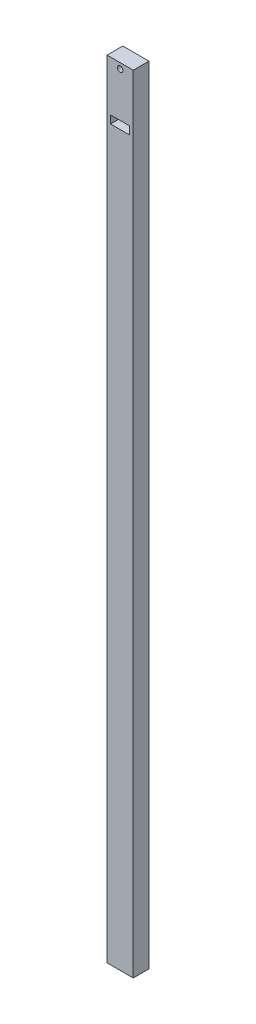
ISO-10303-21;
HEADER;
FILE_DESCRIPTION(('STEP AP214'),'2;1');
FILE_NAME('part.step','',(''),(''),'','','');
FILE_SCHEMA(('AUTOMOTIVE_DESIGN { 1 0 10303 214 1 1 1 1 }'));
ENDSEC;
DATA;
#1=APPLICATION_CONTEXT('core data for automotive mechanical design processes');
#2=APPLICATION_PROTOCOL_DEFINITION('international standard','automotive_design',2000,#1);
#3=PRODUCT_CONTEXT('',#1,'mechanical');
#4=PRODUCT('Part','Part','',(#3));
#5=PRODUCT_RELATED_PRODUCT_CATEGORY('part','',(#4));
#6=PRODUCT_DEFINITION_FORMATION('','',#4);
#7=PRODUCT_DEFINITION_CONTEXT('part definition',#1,'design');
#8=PRODUCT_DEFINITION('design','',#6,#7);
#9=PRODUCT_DEFINITION_SHAPE('','',#8);
#10=(LENGTH_UNIT() NAMED_UNIT(*) SI_UNIT(.MILLI.,.METRE.));
#11=(NAMED_UNIT(*) PLANE_ANGLE_UNIT() SI_UNIT($,.RADIAN.));
#12=(NAMED_UNIT(*) SI_UNIT($,.STERADIAN.) SOLID_ANGLE_UNIT());
#13=UNCERTAINTY_MEASURE_WITH_UNIT(LENGTH_MEASURE(1.E-05),#10,'distance_accuracy_value','');
#14=(GEOMETRIC_REPRESENTATION_CONTEXT(3) GLOBAL_UNCERTAINTY_ASSIGNED_CONTEXT((#13)) GLOBAL_UNIT_ASSIGNED_CONTEXT((#10,
#11,#12)) REPRESENTATION_CONTEXT('',''));
#15=CARTESIAN_POINT('',(0.,0.,0.));
#16=DIRECTION('',(0.,0.,1.));
#17=DIRECTION('',(1.,0.,0.));
#18=AXIS2_PLACEMENT_3D('',#15,#16,#17);
#19=CARTESIAN_POINT('',(0.,300.,6.));
#20=DIRECTION('',(0.,1.,0.));
#21=DIRECTION('',(0.,0.,1.));
#22=AXIS2_PLACEMENT_3D('',#19,#20,#21);
#23=PLANE('',#22);
#24=DIRECTION('',(1.,0.,0.));
#25=VECTOR('',#24,1.);
#26=CARTESIAN_POINT('',(0.,300.,0.));
#27=LINE('',#26,#25);
#28=CARTESIAN_POINT('',(0.,300.,0.));
#29=VERTEX_POINT('',#28);
#30=CARTESIAN_POINT('',(10.,300.,0.));
#31=VERTEX_POINT('',#30);
#32=EDGE_CURVE('E150',#29,#31,#27,.T.);
#33=ORIENTED_EDGE('',*,*,#32,.F.);
#34=DIRECTION('',(0.,0.,-1.));
#35=VECTOR('',#34,1.);
#36=CARTESIAN_POINT('',(0.,300.,6.));
#37=LINE('',#36,#35);
#38=CARTESIAN_POINT('',(0.,300.,6.));
#39=VERTEX_POINT('',#38);
#40=EDGE_CURVE('E11',#39,#29,#37,.T.);
#41=ORIENTED_EDGE('',*,*,#40,.F.);
#42=DIRECTION('',(1.,0.,0.));
#43=VECTOR('',#42,1.);
#44=CARTESIAN_POINT('',(0.,300.,6.));
#45=LINE('',#44,#43);
#46=CARTESIAN_POINT('',(10.,300.,6.));
#47=VERTEX_POINT('',#46);
#48=EDGE_CURVE('E128',#39,#47,#45,.T.);
#49=ORIENTED_EDGE('',*,*,#48,.T.);
#50=DIRECTION('',(0.,0.,-1.));
#51=VECTOR('',#50,1.);
#52=CARTESIAN_POINT('',(10.,300.,6.));
#53=LINE('',#52,#51);
#54=EDGE_CURVE('E89',#47,#31,#53,.T.);
#55=ORIENTED_EDGE('',*,*,#54,.T.);
#56=EDGE_LOOP('',(#33,#41,#49,#55));
#57=FACE_BOUND('',#56,.T.);
#58=ADVANCED_FACE('F35',(#57),#23,.T.);
#59=CARTESIAN_POINT('',(0.,0.,6.));
#60=DIRECTION('',(-1.,0.,0.));
#61=DIRECTION('',(0.,0.,1.));
#62=AXIS2_PLACEMENT_3D('',#59,#60,#61);
#63=PLANE('',#62);
#64=DIRECTION('',(0.,1.,0.));
#65=VECTOR('',#64,1.);
#66=CARTESIAN_POINT('',(0.,0.,0.));
#67=LINE('',#66,#65);
#68=CARTESIAN_POINT('',(0.,0.,0.));
#69=VERTEX_POINT('',#68);
#70=EDGE_CURVE('E117',#69,#29,#67,.T.);
#71=ORIENTED_EDGE('',*,*,#70,.F.);
#72=DIRECTION('',(0.,0.,-1.));
#73=VECTOR('',#72,1.);
#74=CARTESIAN_POINT('',(0.,0.,6.));
#75=LINE('',#74,#73);
#76=CARTESIAN_POINT('',(0.,0.,6.));
#77=VERTEX_POINT('',#76);
#78=EDGE_CURVE('E45',#77,#69,#75,.T.);
#79=ORIENTED_EDGE('',*,*,#78,.F.);
#80=DIRECTION('',(0.,1.,0.));
#81=VECTOR('',#80,1.);
#82=CARTESIAN_POINT('',(0.,0.,6.));
#83=LINE('',#82,#81);
#84=EDGE_CURVE('E115',#77,#39,#83,.T.);
#85=ORIENTED_EDGE('',*,*,#84,.T.);
#86=ORIENTED_EDGE('',*,*,#40,.T.);
#87=EDGE_LOOP('',(#71,#79,#85,#86));
#88=FACE_BOUND('',#87,.T.);
#89=ADVANCED_FACE('F113',(#88),#63,.T.);
#90=CARTESIAN_POINT('',(0.,0.,6.));
#91=DIRECTION('',(0.,1.,0.));
#92=DIRECTION('',(0.,0.,1.));
#93=AXIS2_PLACEMENT_3D('',#90,#91,#92);
#94=PLANE('',#93);
#95=DIRECTION('',(1.,0.,0.));
#96=VECTOR('',#95,1.);
#97=CARTESIAN_POINT('',(0.,0.,0.));
#98=LINE('',#97,#96);
#99=CARTESIAN_POINT('',(10.,0.,0.));
#100=VERTEX_POINT('',#99);
#101=EDGE_CURVE('E153',#69,#100,#98,.T.);
#102=ORIENTED_EDGE('',*,*,#101,.T.);
#103=DIRECTION('',(0.,0.,-1.));
#104=VECTOR('',#103,1.);
#105=CARTESIAN_POINT('',(10.,0.,6.));
#106=LINE('',#105,#104);
#107=CARTESIAN_POINT('',(10.,0.,6.));
#108=VERTEX_POINT('',#107);
#109=EDGE_CURVE('E120',#108,#100,#106,.T.);
#110=ORIENTED_EDGE('',*,*,#109,.F.);
#111=DIRECTION('',(1.,0.,0.));
#112=VECTOR('',#111,1.);
#113=CARTESIAN_POINT('',(0.,0.,6.));
#114=LINE('',#113,#112);
#115=EDGE_CURVE('E123',#77,#108,#114,.T.);
#116=ORIENTED_EDGE('',*,*,#115,.F.);
#117=ORIENTED_EDGE('',*,*,#78,.T.);
#118=EDGE_LOOP('',(#102,#110,#116,#117));
#119=FACE_BOUND('',#118,.T.);
#120=ADVANCED_FACE('F124',(#119),#94,.F.);
#121=CARTESIAN_POINT('',(0.,277.9,6.));
#122=DIRECTION('',(0.,1.,0.));
#123=DIRECTION('',(0.,0.,1.));
#124=AXIS2_PLACEMENT_3D('',#121,#122,#123);
#125=PLANE('',#124);
#126=DIRECTION('',(1.,0.,0.));
#127=VECTOR('',#126,1.);
#128=CARTESIAN_POINT('',(0.,277.9,0.));
#129=LINE('',#128,#127);
#130=CARTESIAN_POINT('',(1.34,277.9,0.));
#131=VERTEX_POINT('',#130);
#132=CARTESIAN_POINT('',(8.66000000000001,277.9,0.));
#133=VERTEX_POINT('',#132);
#134=EDGE_CURVE('E139',#131,#133,#129,.T.);
#135=ORIENTED_EDGE('',*,*,#134,.F.);
#136=DIRECTION('',(0.,0.,-1.));
#137=VECTOR('',#136,1.);
#138=CARTESIAN_POINT('',(1.34,277.9,6.));
#139=LINE('',#138,#137);
#140=CARTESIAN_POINT('',(1.34,277.9,6.));
#141=VERTEX_POINT('',#140);
#142=EDGE_CURVE('E39',#141,#131,#139,.T.);
#143=ORIENTED_EDGE('',*,*,#142,.F.);
#144=DIRECTION('',(1.,0.,0.));
#145=VECTOR('',#144,1.);
#146=CARTESIAN_POINT('',(0.,277.9,6.));
#147=LINE('',#146,#145);
#148=CARTESIAN_POINT('',(8.66000000000001,277.9,6.));
#149=VERTEX_POINT('',#148);
#150=EDGE_CURVE('E159',#141,#149,#147,.T.);
#151=ORIENTED_EDGE('',*,*,#150,.T.);
#152=DIRECTION('',(0.,0.,-1.));
#153=VECTOR('',#152,1.);
#154=CARTESIAN_POINT('',(8.66000000000001,277.9,6.));
#155=LINE('',#154,#153);
#156=EDGE_CURVE('E138',#149,#133,#155,.T.);
#157=ORIENTED_EDGE('',*,*,#156,.T.);
#158=EDGE_LOOP('',(#135,#143,#151,#157));
#159=FACE_BOUND('',#158,.T.);
#160=ADVANCED_FACE('F37',(#159),#125,.T.);
#161=CARTESIAN_POINT('',(1.33999999999986,0.,6.));
#162=DIRECTION('',(1.,0.,0.));
#163=DIRECTION('',(0.,1.,0.));
#164=AXIS2_PLACEMENT_3D('',#161,#162,#163);
#165=PLANE('',#164);
#166=DIRECTION('',(0.,-1.,0.));
#167=VECTOR('',#166,1.);
#168=CARTESIAN_POINT('',(1.33999999999986,0.,0.));
#169=LINE('',#168,#167);
#170=CARTESIAN_POINT('',(1.34,280.9,0.));
#171=VERTEX_POINT('',#170);
#172=EDGE_CURVE('E142',#171,#131,#169,.T.);
#173=ORIENTED_EDGE('',*,*,#172,.F.);
#174=DIRECTION('',(0.,0.,-1.));
#175=VECTOR('',#174,1.);
#176=CARTESIAN_POINT('',(1.34,280.9,6.));
#177=LINE('',#176,#175);
#178=CARTESIAN_POINT('',(1.34,280.9,6.));
#179=VERTEX_POINT('',#178);
#180=EDGE_CURVE('E165',#179,#171,#177,.T.);
#181=ORIENTED_EDGE('',*,*,#180,.F.);
#182=DIRECTION('',(0.,-1.,0.));
#183=VECTOR('',#182,1.);
#184=CARTESIAN_POINT('',(1.33999999999986,0.,6.));
#185=LINE('',#184,#183);
#186=EDGE_CURVE('E174',#179,#141,#185,.T.);
#187=ORIENTED_EDGE('',*,*,#186,.T.);
#188=ORIENTED_EDGE('',*,*,#142,.T.);
#189=EDGE_LOOP('',(#173,#181,#187,#188));
#190=FACE_BOUND('',#189,.T.);
#191=ADVANCED_FACE('F172',(#190),#165,.T.);
#192=CARTESIAN_POINT('',(0.,280.9,6.));
#193=DIRECTION('',(0.,1.,0.));
#194=DIRECTION('',(0.,0.,1.));
#195=AXIS2_PLACEMENT_3D('',#192,#193,#194);
#196=PLANE('',#195);
#197=DIRECTION('',(1.,0.,0.));
#198=VECTOR('',#197,1.);
#199=CARTESIAN_POINT('',(0.,280.9,0.));
#200=LINE('',#199,#198);
#201=CARTESIAN_POINT('',(8.66000000000001,280.9,0.));
#202=VERTEX_POINT('',#201);
#203=EDGE_CURVE('E145',#171,#202,#200,.T.);
#204=ORIENTED_EDGE('',*,*,#203,.T.);
#205=DIRECTION('',(0.,0.,-1.));
#206=VECTOR('',#205,1.);
#207=CARTESIAN_POINT('',(8.66000000000001,280.9,6.));
#208=LINE('',#207,#206);
#209=CARTESIAN_POINT('',(8.66000000000001,280.9,6.));
#210=VERTEX_POINT('',#209);
#211=EDGE_CURVE('E163',#210,#202,#208,.T.);
#212=ORIENTED_EDGE('',*,*,#211,.F.);
#213=DIRECTION('',(1.,0.,0.));
#214=VECTOR('',#213,1.);
#215=CARTESIAN_POINT('',(0.,280.9,6.));
#216=LINE('',#215,#214);
#217=EDGE_CURVE('E185',#179,#210,#216,.T.);
#218=ORIENTED_EDGE('',*,*,#217,.F.);
#219=ORIENTED_EDGE('',*,*,#180,.T.);
#220=EDGE_LOOP('',(#204,#212,#218,#219));
#221=FACE_BOUND('',#220,.T.);
#222=ADVANCED_FACE('F180',(#221),#196,.F.);
#223=CARTESIAN_POINT('',(10.,0.,6.));
#224=DIRECTION('',(-1.,0.,0.));
#225=DIRECTION('',(0.,0.,1.));
#226=AXIS2_PLACEMENT_3D('',#223,#224,#225);
#227=PLANE('',#226);
#228=DIRECTION('',(0.,1.,0.));
#229=VECTOR('',#228,1.);
#230=CARTESIAN_POINT('',(10.,0.,0.));
#231=LINE('',#230,#229);
#232=EDGE_CURVE('E82',#100,#31,#231,.T.);
#233=ORIENTED_EDGE('',*,*,#232,.T.);
#234=ORIENTED_EDGE('',*,*,#54,.F.);
#235=DIRECTION('',(0.,1.,0.));
#236=VECTOR('',#235,1.);
#237=CARTESIAN_POINT('',(10.,0.,6.));
#238=LINE('',#237,#236);
#239=EDGE_CURVE('E54',#108,#47,#238,.T.);
#240=ORIENTED_EDGE('',*,*,#239,.F.);
#241=ORIENTED_EDGE('',*,*,#109,.T.);
#242=EDGE_LOOP('',(#233,#234,#240,#241));
#243=FACE_BOUND('',#242,.T.);
#244=ADVANCED_FACE('F209',(#243),#227,.F.);
#245=CARTESIAN_POINT('',(8.66000000000001,0.,6.));
#246=DIRECTION('',(1.,0.,0.));
#247=DIRECTION('',(0.,0.,-1.));
#248=AXIS2_PLACEMENT_3D('',#245,#246,#247);
#249=PLANE('',#248);
#250=DIRECTION('',(0.,-1.,0.));
#251=VECTOR('',#250,1.);
#252=CARTESIAN_POINT('',(8.66000000000001,0.,0.));
#253=LINE('',#252,#251);
#254=EDGE_CURVE('E147',#202,#133,#253,.T.);
#255=ORIENTED_EDGE('',*,*,#254,.T.);
#256=ORIENTED_EDGE('',*,*,#156,.F.);
#257=DIRECTION('',(0.,-1.,0.));
#258=VECTOR('',#257,1.);
#259=CARTESIAN_POINT('',(8.66000000000001,0.,6.));
#260=LINE('',#259,#258);
#261=EDGE_CURVE('E130',#210,#149,#260,.T.);
#262=ORIENTED_EDGE('',*,*,#261,.F.);
#263=ORIENTED_EDGE('',*,*,#211,.T.);
#264=EDGE_LOOP('',(#255,#256,#262,#263));
#265=FACE_BOUND('',#264,.T.);
#266=ADVANCED_FACE('F183',(#265),#249,.F.);
#267=CARTESIAN_POINT('',(5.,297.9,6.));
#268=DIRECTION('',(0.,0.,-1.));
#269=DIRECTION('',(-1.,0.,0.));
#270=AXIS2_PLACEMENT_3D('',#267,#268,#269);
#271=CYLINDRICAL_SURFACE('',#270,1.05999999999999);
#272=CARTESIAN_POINT('',(5.,297.9,6.));
#273=DIRECTION('',(0.,0.,1.));
#274=DIRECTION('',(1.,0.,0.));
#275=AXIS2_PLACEMENT_3D('',#272,#273,#274);
#276=CIRCLE('',#275,1.05999999999999);
#277=CARTESIAN_POINT('',(6.05999999999999,297.9,6.));
#278=VERTEX_POINT('',#277);
#279=EDGE_CURVE('E135',#278,#278,#276,.T.);
#280=ORIENTED_EDGE('',*,*,#279,.T.);
#281=EDGE_LOOP('',(#280));
#282=FACE_BOUND('',#281,.T.);
#283=CARTESIAN_POINT('',(5.,297.9,0.));
#284=DIRECTION('',(0.,0.,1.));
#285=DIRECTION('',(1.,0.,0.));
#286=AXIS2_PLACEMENT_3D('',#283,#284,#285);
#287=CIRCLE('',#286,1.05999999999999);
#288=CARTESIAN_POINT('',(6.05999999999999,297.9,0.));
#289=VERTEX_POINT('',#288);
#290=EDGE_CURVE('E156',#289,#289,#287,.T.);
#291=ORIENTED_EDGE('',*,*,#290,.F.);
#292=EDGE_LOOP('',(#291));
#293=FACE_BOUND('',#292,.T.);
#294=ADVANCED_FACE('F190',(#282,#293),#271,.F.);
#295=CARTESIAN_POINT('',(0.,0.,6.));
#296=DIRECTION('',(0.,0.,1.));
#297=DIRECTION('',(1.,0.,0.));
#298=AXIS2_PLACEMENT_3D('',#295,#296,#297);
#299=PLANE('',#298);
#300=ORIENTED_EDGE('',*,*,#150,.F.);
#301=ORIENTED_EDGE('',*,*,#186,.F.);
#302=ORIENTED_EDGE('',*,*,#217,.T.);
#303=ORIENTED_EDGE('',*,*,#261,.T.);
#304=EDGE_LOOP('',(#300,#301,#302,#303));
#305=FACE_BOUND('',#304,.T.);
#306=ORIENTED_EDGE('',*,*,#48,.F.);
#307=ORIENTED_EDGE('',*,*,#84,.F.);
#308=ORIENTED_EDGE('',*,*,#115,.T.);
#309=ORIENTED_EDGE('',*,*,#239,.T.);
#310=EDGE_LOOP('',(#306,#307,#308,#309));
#311=FACE_BOUND('',#310,.T.);
#312=ORIENTED_EDGE('',*,*,#279,.F.);
#313=EDGE_LOOP('',(#312));
#314=FACE_BOUND('',#313,.T.);
#315=ADVANCED_FACE('F126',(#305,#311,#314),#299,.T.);
#316=CARTESIAN_POINT('',(0.,0.,0.));
#317=DIRECTION('',(0.,0.,1.));
#318=DIRECTION('',(1.,0.,0.));
#319=AXIS2_PLACEMENT_3D('',#316,#317,#318);
#320=PLANE('',#319);
#321=ORIENTED_EDGE('',*,*,#134,.T.);
#322=ORIENTED_EDGE('',*,*,#254,.F.);
#323=ORIENTED_EDGE('',*,*,#203,.F.);
#324=ORIENTED_EDGE('',*,*,#172,.T.);
#325=EDGE_LOOP('',(#321,#322,#323,#324));
#326=FACE_BOUND('',#325,.T.);
#327=ORIENTED_EDGE('',*,*,#32,.T.);
#328=ORIENTED_EDGE('',*,*,#232,.F.);
#329=ORIENTED_EDGE('',*,*,#101,.F.);
#330=ORIENTED_EDGE('',*,*,#70,.T.);
#331=EDGE_LOOP('',(#327,#328,#329,#330));
#332=FACE_BOUND('',#331,.T.);
#333=ORIENTED_EDGE('',*,*,#290,.T.);
#334=EDGE_LOOP('',(#333));
#335=FACE_BOUND('',#334,.T.);
#336=ADVANCED_FACE('F178',(#326,#332,#335),#320,.F.);
#337=CLOSED_SHELL('',(#58,#89,#120,#160,#191,#222,#244,#266,#294,#315,#336));
#338=MANIFOLD_SOLID_BREP('B2',#337);
#339=ADVANCED_BREP_SHAPE_REPRESENTATION('',(#18,#338),#14);
#340=SHAPE_DEFINITION_REPRESENTATION(#9,#339);
ENDSEC;
END-ISO-10303-21;
